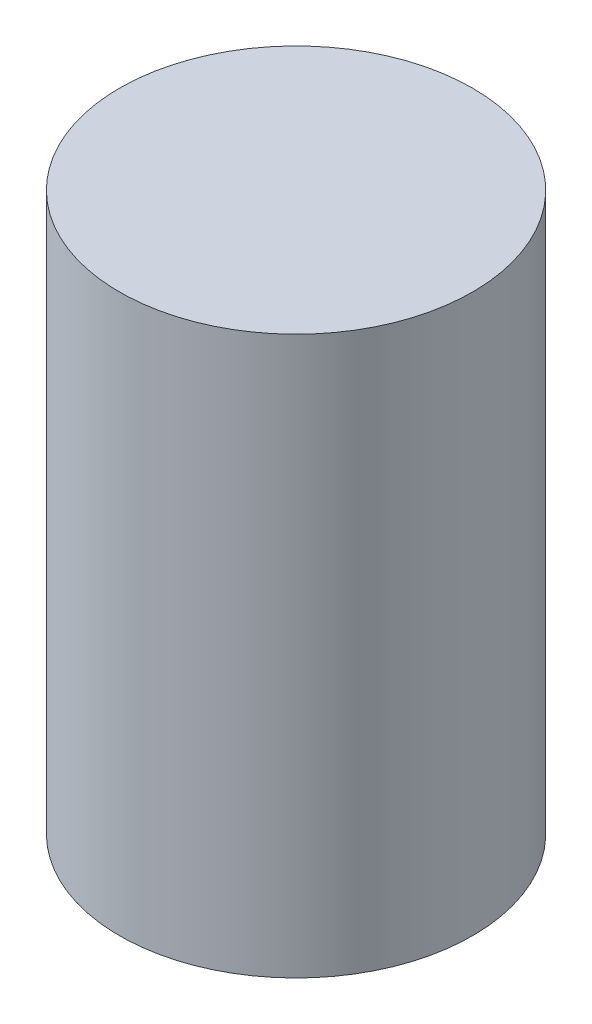
ISO-10303-21;
HEADER;
FILE_DESCRIPTION(('STEP AP214'),'2;1');
FILE_NAME('part.step','',(''),(''),'','','');
FILE_SCHEMA(('AUTOMOTIVE_DESIGN { 1 0 10303 214 1 1 1 1 }'));
ENDSEC;
DATA;
#1=APPLICATION_CONTEXT('core data for automotive mechanical design processes');
#2=APPLICATION_PROTOCOL_DEFINITION('international standard','automotive_design',2000,#1);
#3=PRODUCT_CONTEXT('',#1,'mechanical');
#4=PRODUCT('Part','Part','',(#3));
#5=PRODUCT_RELATED_PRODUCT_CATEGORY('part','',(#4));
#6=PRODUCT_DEFINITION_FORMATION('','',#4);
#7=PRODUCT_DEFINITION_CONTEXT('part definition',#1,'design');
#8=PRODUCT_DEFINITION('design','',#6,#7);
#9=PRODUCT_DEFINITION_SHAPE('','',#8);
#10=(LENGTH_UNIT() NAMED_UNIT(*) SI_UNIT(.MILLI.,.METRE.));
#11=(NAMED_UNIT(*) PLANE_ANGLE_UNIT() SI_UNIT($,.RADIAN.));
#12=(NAMED_UNIT(*) SI_UNIT($,.STERADIAN.) SOLID_ANGLE_UNIT());
#13=UNCERTAINTY_MEASURE_WITH_UNIT(LENGTH_MEASURE(1.E-05),#10,'distance_accuracy_value','');
#14=(GEOMETRIC_REPRESENTATION_CONTEXT(3) GLOBAL_UNCERTAINTY_ASSIGNED_CONTEXT((#13)) GLOBAL_UNIT_ASSIGNED_CONTEXT((#10,
#11,#12)) REPRESENTATION_CONTEXT('',''));
#15=CARTESIAN_POINT('',(0.,0.,0.));
#16=DIRECTION('',(0.,0.,1.));
#17=DIRECTION('',(1.,0.,0.));
#18=AXIS2_PLACEMENT_3D('',#15,#16,#17);
#19=CARTESIAN_POINT('',(0.,15.24,0.));
#20=DIRECTION('',(0.,-1.,0.));
#21=DIRECTION('',(0.,0.,-1.));
#22=AXIS2_PLACEMENT_3D('',#19,#20,#21);
#23=CYLINDRICAL_SURFACE('',#22,4.826);
#24=CARTESIAN_POINT('',(0.,15.24,0.));
#25=DIRECTION('',(0.,1.,0.));
#26=DIRECTION('',(0.,0.,1.));
#27=AXIS2_PLACEMENT_3D('',#24,#25,#26);
#28=CIRCLE('',#27,4.826);
#29=CARTESIAN_POINT('',(0.,15.24,-4.826));
#30=VERTEX_POINT('',#29);
#31=EDGE_CURVE('E10',#30,#30,#28,.T.);
#32=CARTESIAN_POINT('',(0.,0.,0.));
#33=DIRECTION('',(0.,1.,0.));
#34=DIRECTION('',(0.,0.,1.));
#35=AXIS2_PLACEMENT_3D('',#32,#33,#34);
#36=CIRCLE('',#35,4.826);
#37=CARTESIAN_POINT('',(0.,0.,-4.826));
#38=VERTEX_POINT('',#37);
#39=EDGE_CURVE('E38',#38,#38,#36,.T.);
#40=CARTESIAN_POINT('',(0.,15.24,-4.826));
#41=CARTESIAN_POINT('',(0.,15.08125,-4.826));
#42=CARTESIAN_POINT('',(0.,14.9225,-4.826));
#43=CARTESIAN_POINT('',(0.,14.605,-4.826));
#44=CARTESIAN_POINT('',(0.,14.44625,-4.826));
#45=CARTESIAN_POINT('',(0.,14.12875,-4.826));
#46=CARTESIAN_POINT('',(0.,13.97,-4.826));
#47=CARTESIAN_POINT('',(0.,13.6525,-4.826));
#48=CARTESIAN_POINT('',(0.,13.49375,-4.826));
#49=CARTESIAN_POINT('',(0.,13.17625,-4.826));
#50=CARTESIAN_POINT('',(0.,13.0175,-4.826));
#51=CARTESIAN_POINT('',(0.,12.7,-4.826));
#52=CARTESIAN_POINT('',(0.,12.54125,-4.826));
#53=CARTESIAN_POINT('',(0.,12.22375,-4.826));
#54=CARTESIAN_POINT('',(0.,12.065,-4.826));
#55=CARTESIAN_POINT('',(0.,11.7475,-4.826));
#56=CARTESIAN_POINT('',(0.,11.58875,-4.826));
#57=CARTESIAN_POINT('',(0.,11.27125,-4.826));
#58=CARTESIAN_POINT('',(0.,11.1125,-4.826));
#59=CARTESIAN_POINT('',(0.,10.795,-4.826));
#60=CARTESIAN_POINT('',(0.,10.63625,-4.826));
#61=CARTESIAN_POINT('',(0.,10.31875,-4.826));
#62=CARTESIAN_POINT('',(0.,10.16,-4.826));
#63=CARTESIAN_POINT('',(0.,9.8425,-4.826));
#64=CARTESIAN_POINT('',(0.,9.68375,-4.826));
#65=CARTESIAN_POINT('',(0.,9.36625,-4.826));
#66=CARTESIAN_POINT('',(0.,9.2075,-4.826));
#67=CARTESIAN_POINT('',(0.,8.89,-4.826));
#68=CARTESIAN_POINT('',(0.,8.73125,-4.826));
#69=CARTESIAN_POINT('',(0.,8.41375,-4.826));
#70=CARTESIAN_POINT('',(0.,8.255,-4.826));
#71=CARTESIAN_POINT('',(0.,7.9375,-4.826));
#72=CARTESIAN_POINT('',(0.,7.77875,-4.826));
#73=CARTESIAN_POINT('',(0.,7.46125,-4.826));
#74=CARTESIAN_POINT('',(0.,7.3025,-4.826));
#75=CARTESIAN_POINT('',(0.,6.985,-4.826));
#76=CARTESIAN_POINT('',(0.,6.82625,-4.826));
#77=CARTESIAN_POINT('',(0.,6.50875,-4.826));
#78=CARTESIAN_POINT('',(0.,6.35,-4.826));
#79=CARTESIAN_POINT('',(0.,6.0325,-4.826));
#80=CARTESIAN_POINT('',(0.,5.87375,-4.826));
#81=CARTESIAN_POINT('',(0.,5.55625,-4.826));
#82=CARTESIAN_POINT('',(0.,5.3975,-4.826));
#83=CARTESIAN_POINT('',(0.,5.08,-4.826));
#84=CARTESIAN_POINT('',(0.,4.92125,-4.826));
#85=CARTESIAN_POINT('',(0.,4.60375,-4.826));
#86=CARTESIAN_POINT('',(0.,4.445,-4.826));
#87=CARTESIAN_POINT('',(0.,4.1275,-4.826));
#88=CARTESIAN_POINT('',(0.,3.96875,-4.826));
#89=CARTESIAN_POINT('',(0.,3.65125,-4.826));
#90=CARTESIAN_POINT('',(0.,3.4925,-4.826));
#91=CARTESIAN_POINT('',(0.,3.175,-4.826));
#92=CARTESIAN_POINT('',(0.,3.01625,-4.826));
#93=CARTESIAN_POINT('',(0.,2.69875,-4.826));
#94=CARTESIAN_POINT('',(0.,2.54,-4.826));
#95=CARTESIAN_POINT('',(0.,2.2225,-4.826));
#96=CARTESIAN_POINT('',(0.,2.06375,-4.826));
#97=CARTESIAN_POINT('',(0.,1.74625,-4.826));
#98=CARTESIAN_POINT('',(0.,1.5875,-4.826));
#99=CARTESIAN_POINT('',(0.,1.27,-4.826));
#100=CARTESIAN_POINT('',(0.,1.11125,-4.826));
#101=CARTESIAN_POINT('',(0.,0.79375,-4.826));
#102=CARTESIAN_POINT('',(0.,0.634999999999999,-4.826));
#103=CARTESIAN_POINT('',(0.,0.3175,-4.826));
#104=CARTESIAN_POINT('',(0.,0.15875,-4.826));
#105=CARTESIAN_POINT('',(0.,0.,-4.826));
#106=B_SPLINE_CURVE_WITH_KNOTS('',3,(#40,#41,#42,#43,#44,#45,#46,#47,#48,#49,#50,#51,#52,#53,
#54,#55,#56,#57,#58,#59,#60,#61,#62,#63,#64,#65,#66,#67,#68,#69,#70,#71,#72,#73,#74,#75,#76,#77,
#78,#79,#80,#81,#82,#83,#84,#85,#86,#87,#88,#89,#90,#91,#92,#93,#94,#95,#96,#97,#98,#99,#100,
#101,#102,#103,#104,#105),.UNSPECIFIED.,.F.,.F.,(4,2,2,2,2,2,2,2,2,2,2,2,2,2,2,2,2,2,2,2,2,2,2,
2,2,2,2,2,2,2,2,2,4),(0.,0.476249999999999,0.952499999999998,1.42875,1.905,2.38125,2.8575,
3.33375,3.81,4.28625,4.7625,5.23875,5.715,6.19125,6.6675,7.14375,7.62,8.09625,8.5725,9.04875,
9.525,10.00125,10.4775,10.95375,11.43,11.90625,12.3825,12.85875,13.335,13.81125,14.2875,
14.76375,15.24),.UNSPECIFIED.);
#107=EDGE_CURVE('BSEAM35',#30,#38,#106,.T.);
#108=ORIENTED_EDGE('',*,*,#31,.F.);
#109=ORIENTED_EDGE('',*,*,#39,.T.);
#110=ORIENTED_EDGE('',*,*,#107,.T.);
#111=ORIENTED_EDGE('',*,*,#107,.F.);
#112=EDGE_LOOP('',(#108,#110,#109,#111));
#113=FACE_BOUND('',#112,.T.);
#114=ADVANCED_FACE('F35',(#113),#23,.T.);
#115=CARTESIAN_POINT('',(0.,15.24,0.));
#116=DIRECTION('',(0.,1.,0.));
#117=DIRECTION('',(0.,0.,1.));
#118=AXIS2_PLACEMENT_3D('',#115,#116,#117);
#119=PLANE('',#118);
#120=ORIENTED_EDGE('',*,*,#31,.T.);
#121=EDGE_LOOP('',(#120));
#122=FACE_BOUND('',#121,.T.);
#123=ADVANCED_FACE('F50',(#122),#119,.T.);
#124=CARTESIAN_POINT('',(0.,0.,0.));
#125=DIRECTION('',(0.,1.,0.));
#126=DIRECTION('',(0.,0.,1.));
#127=AXIS2_PLACEMENT_3D('',#124,#125,#126);
#128=PLANE('',#127);
#129=ORIENTED_EDGE('',*,*,#39,.F.);
#130=EDGE_LOOP('',(#129));
#131=FACE_BOUND('',#130,.T.);
#132=ADVANCED_FACE('F48',(#131),#128,.F.);
#133=CLOSED_SHELL('',(#114,#123,#132));
#134=MANIFOLD_SOLID_BREP('B2',#133);
#135=ADVANCED_BREP_SHAPE_REPRESENTATION('',(#18,#134),#14);
#136=SHAPE_DEFINITION_REPRESENTATION(#9,#135);
ENDSEC;
END-ISO-10303-21;
